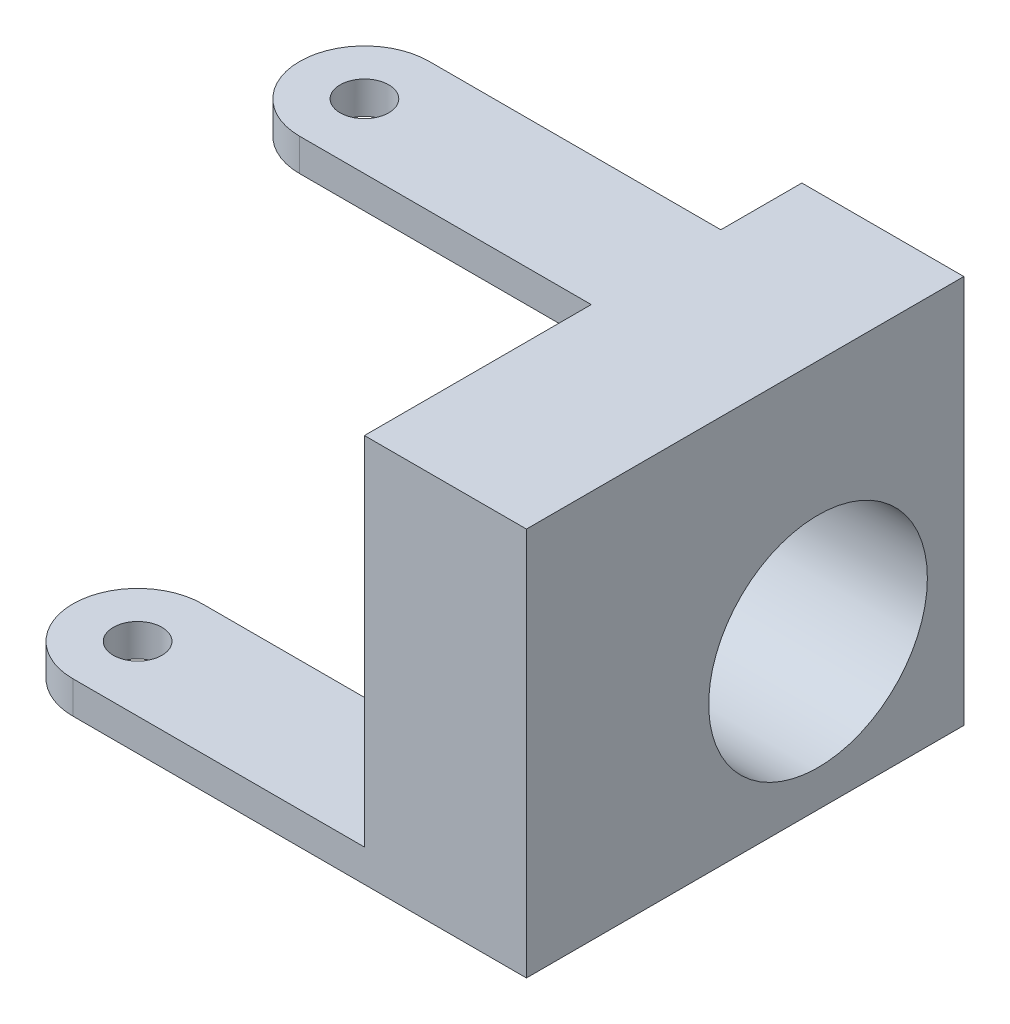
ISO-10303-21;
HEADER;
FILE_DESCRIPTION(('STEP AP214'),'2;1');
FILE_NAME('part.step','',(''),(''),'','','');
FILE_SCHEMA(('AUTOMOTIVE_DESIGN { 1 0 10303 214 1 1 1 1 }'));
ENDSEC;
DATA;
#1=APPLICATION_CONTEXT('core data for automotive mechanical design processes');
#2=APPLICATION_PROTOCOL_DEFINITION('international standard','automotive_design',2000,#1);
#3=PRODUCT_CONTEXT('',#1,'mechanical');
#4=PRODUCT('Part','Part','',(#3));
#5=PRODUCT_RELATED_PRODUCT_CATEGORY('part','',(#4));
#6=PRODUCT_DEFINITION_FORMATION('','',#4);
#7=PRODUCT_DEFINITION_CONTEXT('part definition',#1,'design');
#8=PRODUCT_DEFINITION('design','',#6,#7);
#9=PRODUCT_DEFINITION_SHAPE('','',#8);
#10=(LENGTH_UNIT() NAMED_UNIT(*) SI_UNIT(.MILLI.,.METRE.));
#11=(NAMED_UNIT(*) PLANE_ANGLE_UNIT() SI_UNIT($,.RADIAN.));
#12=(NAMED_UNIT(*) SI_UNIT($,.STERADIAN.) SOLID_ANGLE_UNIT());
#13=UNCERTAINTY_MEASURE_WITH_UNIT(LENGTH_MEASURE(1.E-05),#10,'distance_accuracy_value','');
#14=(GEOMETRIC_REPRESENTATION_CONTEXT(3) GLOBAL_UNCERTAINTY_ASSIGNED_CONTEXT((#13)) GLOBAL_UNIT_ASSIGNED_CONTEXT((#10,
#11,#12)) REPRESENTATION_CONTEXT('',''));
#15=CARTESIAN_POINT('',(0.,0.,0.));
#16=DIRECTION('',(0.,0.,1.));
#17=DIRECTION('',(1.,0.,0.));
#18=AXIS2_PLACEMENT_3D('',#15,#16,#17);
#19=CARTESIAN_POINT('',(-23.,2.,14.));
#20=DIRECTION('',(0.,1.,0.));
#21=DIRECTION('',(0.,0.,1.));
#22=AXIS2_PLACEMENT_3D('',#19,#20,#21);
#23=CYLINDRICAL_SURFACE('',#22,4.);
#24=DIRECTION('',(0.,-1.,0.));
#25=VECTOR('',#24,1.);
#26=CARTESIAN_POINT('',(-23.,2.,18.));
#27=LINE('',#26,#25);
#28=CARTESIAN_POINT('',(-23.,2.,18.));
#29=VERTEX_POINT('',#28);
#30=CARTESIAN_POINT('',(-23.,0.,18.));
#31=VERTEX_POINT('',#30);
#32=EDGE_CURVE('E214',#29,#31,#27,.T.);
#33=ORIENTED_EDGE('',*,*,#32,.F.);
#34=CARTESIAN_POINT('',(-23.,2.,14.));
#35=DIRECTION('',(0.,-1.,0.));
#36=DIRECTION('',(0.,0.,-1.));
#37=AXIS2_PLACEMENT_3D('',#34,#35,#36);
#38=CIRCLE('',#37,4.);
#39=CARTESIAN_POINT('',(-23.,2.,10.));
#40=VERTEX_POINT('',#39);
#41=EDGE_CURVE('E56',#40,#29,#38,.F.);
#42=ORIENTED_EDGE('',*,*,#41,.F.);
#43=DIRECTION('',(0.,-1.,0.));
#44=VECTOR('',#43,1.);
#45=CARTESIAN_POINT('',(-23.,2.,10.));
#46=LINE('',#45,#44);
#47=CARTESIAN_POINT('',(-23.,0.,10.));
#48=VERTEX_POINT('',#47);
#49=EDGE_CURVE('E218',#48,#40,#46,.F.);
#50=ORIENTED_EDGE('',*,*,#49,.F.);
#51=CARTESIAN_POINT('',(-23.,0.,14.));
#52=DIRECTION('',(0.,-1.,0.));
#53=DIRECTION('',(0.,0.,-1.));
#54=AXIS2_PLACEMENT_3D('',#51,#52,#53);
#55=CIRCLE('',#54,4.);
#56=EDGE_CURVE('E11',#31,#48,#55,.T.);
#57=ORIENTED_EDGE('',*,*,#56,.F.);
#58=EDGE_LOOP('',(#33,#42,#50,#57));
#59=FACE_BOUND('',#58,.T.);
#60=ADVANCED_FACE('F47',(#59),#23,.T.);
#61=CARTESIAN_POINT('',(-4.99999999999999,24.,18.));
#62=DIRECTION('',(1.,0.,0.));
#63=DIRECTION('',(0.,0.,-1.));
#64=AXIS2_PLACEMENT_3D('',#61,#62,#63);
#65=PLANE('',#64);
#66=CARTESIAN_POINT('',(-5.,9.,0.));
#67=DIRECTION('',(1.,0.,0.));
#68=DIRECTION('',(0.,0.,-1.));
#69=AXIS2_PLACEMENT_3D('',#66,#67,#68);
#70=CIRCLE('',#69,6.75);
#71=CARTESIAN_POINT('',(-5.,9.,-6.75));
#72=VERTEX_POINT('',#71);
#73=EDGE_CURVE('E175',#72,#72,#70,.F.);
#74=ORIENTED_EDGE('',*,*,#73,.F.);
#75=EDGE_LOOP('',(#74));
#76=FACE_BOUND('',#75,.T.);
#77=DIRECTION('',(0.,0.,-1.));
#78=VECTOR('',#77,1.);
#79=CARTESIAN_POINT('',(-4.99999999999999,2.,18.));
#80=LINE('',#79,#78);
#81=CARTESIAN_POINT('',(-4.99999999999999,2.,18.));
#82=VERTEX_POINT('',#81);
#83=CARTESIAN_POINT('',(-5.,2.,9.99999999999999));
#84=VERTEX_POINT('',#83);
#85=EDGE_CURVE('E282',#82,#84,#80,.T.);
#86=ORIENTED_EDGE('',*,*,#85,.F.);
#87=DIRECTION('',(0.,-1.,0.));
#88=VECTOR('',#87,1.);
#89=CARTESIAN_POINT('',(-4.99999999999999,24.,18.));
#90=LINE('',#89,#88);
#91=CARTESIAN_POINT('',(-4.99999999999999,24.,18.));
#92=VERTEX_POINT('',#91);
#93=EDGE_CURVE('E189',#92,#82,#90,.T.);
#94=ORIENTED_EDGE('',*,*,#93,.F.);
#95=DIRECTION('',(0.,0.,1.));
#96=VECTOR('',#95,1.);
#97=CARTESIAN_POINT('',(-4.99999999999999,24.,18.));
#98=LINE('',#97,#96);
#99=CARTESIAN_POINT('',(-5.,24.,4.));
#100=VERTEX_POINT('',#99);
#101=EDGE_CURVE('E161',#100,#92,#98,.T.);
#102=ORIENTED_EDGE('',*,*,#101,.F.);
#103=DIRECTION('',(0.,-1.,0.));
#104=VECTOR('',#103,1.);
#105=CARTESIAN_POINT('',(-5.,24.,4.));
#106=LINE('',#105,#104);
#107=CARTESIAN_POINT('',(-5.,22.,4.));
#108=VERTEX_POINT('',#107);
#109=EDGE_CURVE('E153',#100,#108,#106,.T.);
#110=ORIENTED_EDGE('',*,*,#109,.T.);
#111=DIRECTION('',(0.,0.,-1.));
#112=VECTOR('',#111,1.);
#113=CARTESIAN_POINT('',(-4.99999999999999,22.,18.));
#114=LINE('',#113,#112);
#115=CARTESIAN_POINT('',(-5.,22.,-4.));
#116=VERTEX_POINT('',#115);
#117=EDGE_CURVE('E151',#108,#116,#114,.T.);
#118=ORIENTED_EDGE('',*,*,#117,.T.);
#119=DIRECTION('',(0.,1.,0.));
#120=VECTOR('',#119,1.);
#121=CARTESIAN_POINT('',(-5.,24.,-4.));
#122=LINE('',#121,#120);
#123=CARTESIAN_POINT('',(-5.,24.,-4.));
#124=VERTEX_POINT('',#123);
#125=EDGE_CURVE('E133',#116,#124,#122,.T.);
#126=ORIENTED_EDGE('',*,*,#125,.T.);
#127=CARTESIAN_POINT('',(-5.,24.,-9.));
#128=VERTEX_POINT('',#127);
#129=EDGE_CURVE('E148',#128,#124,#98,.T.);
#130=ORIENTED_EDGE('',*,*,#129,.F.);
#131=DIRECTION('',(0.,-1.,0.));
#132=VECTOR('',#131,1.);
#133=CARTESIAN_POINT('',(-5.,24.,-9.));
#134=LINE('',#133,#132);
#135=CARTESIAN_POINT('',(-5.,0.,-9.));
#136=VERTEX_POINT('',#135);
#137=EDGE_CURVE('E193',#128,#136,#134,.T.);
#138=ORIENTED_EDGE('',*,*,#137,.T.);
#139=DIRECTION('',(0.,0.,1.));
#140=VECTOR('',#139,1.);
#141=CARTESIAN_POINT('',(-4.99999999999999,0.,18.));
#142=LINE('',#141,#140);
#143=CARTESIAN_POINT('',(-5.,0.,9.99999999999999));
#144=VERTEX_POINT('',#143);
#145=EDGE_CURVE('E178',#136,#144,#142,.T.);
#146=ORIENTED_EDGE('',*,*,#145,.T.);
#147=DIRECTION('',(0.,-1.,0.));
#148=VECTOR('',#147,1.);
#149=CARTESIAN_POINT('',(-5.,0.,9.99999999999999));
#150=LINE('',#149,#148);
#151=EDGE_CURVE('E277',#84,#144,#150,.T.);
#152=ORIENTED_EDGE('',*,*,#151,.F.);
#153=EDGE_LOOP('',(#86,#94,#102,#110,#118,#126,#130,#138,#146,#152));
#154=FACE_BOUND('',#153,.T.);
#155=ADVANCED_FACE('F146',(#76,#154),#65,.F.);
#156=CARTESIAN_POINT('',(-23.,24.,0.));
#157=DIRECTION('',(0.,-1.,0.));
#158=DIRECTION('',(0.,0.,-1.));
#159=AXIS2_PLACEMENT_3D('',#156,#157,#158);
#160=CYLINDRICAL_SURFACE('',#159,4.);
#161=DIRECTION('',(0.,1.,0.));
#162=VECTOR('',#161,1.);
#163=CARTESIAN_POINT('',(-23.,24.,4.00000000000001));
#164=LINE('',#163,#162);
#165=CARTESIAN_POINT('',(-23.,24.,4.00000000000001));
#166=VERTEX_POINT('',#165);
#167=CARTESIAN_POINT('',(-23.,22.,4.));
#168=VERTEX_POINT('',#167);
#169=EDGE_CURVE('E202',#166,#168,#164,.F.);
#170=ORIENTED_EDGE('',*,*,#169,.F.);
#171=CARTESIAN_POINT('',(-23.,24.,0.));
#172=DIRECTION('',(0.,-1.,0.));
#173=DIRECTION('',(0.,0.,-1.));
#174=AXIS2_PLACEMENT_3D('',#171,#172,#173);
#175=CIRCLE('',#174,4.);
#176=CARTESIAN_POINT('',(-23.,24.,-4.));
#177=VERTEX_POINT('',#176);
#178=EDGE_CURVE('E208',#177,#166,#175,.F.);
#179=ORIENTED_EDGE('',*,*,#178,.F.);
#180=DIRECTION('',(0.,1.,0.));
#181=VECTOR('',#180,1.);
#182=CARTESIAN_POINT('',(-23.,24.,-4.));
#183=LINE('',#182,#181);
#184=CARTESIAN_POINT('',(-23.,22.,-4.));
#185=VERTEX_POINT('',#184);
#186=EDGE_CURVE('E136',#185,#177,#183,.T.);
#187=ORIENTED_EDGE('',*,*,#186,.F.);
#188=CARTESIAN_POINT('',(-23.,22.,0.));
#189=DIRECTION('',(0.,-1.,0.));
#190=DIRECTION('',(0.,0.,-1.));
#191=AXIS2_PLACEMENT_3D('',#188,#189,#190);
#192=CIRCLE('',#191,4.);
#193=EDGE_CURVE('E211',#168,#185,#192,.T.);
#194=ORIENTED_EDGE('',*,*,#193,.F.);
#195=EDGE_LOOP('',(#170,#179,#187,#194));
#196=FACE_BOUND('',#195,.T.);
#197=ADVANCED_FACE('F317',(#196),#160,.T.);
#198=CARTESIAN_POINT('',(5.,24.,18.));
#199=DIRECTION('',(-1.,0.,0.));
#200=DIRECTION('',(0.,0.,1.));
#201=AXIS2_PLACEMENT_3D('',#198,#199,#200);
#202=PLANE('',#201);
#203=DIRECTION('',(0.,-1.,0.));
#204=VECTOR('',#203,1.);
#205=CARTESIAN_POINT('',(5.,24.,-9.));
#206=LINE('',#205,#204);
#207=CARTESIAN_POINT('',(5.,24.,-9.));
#208=VERTEX_POINT('',#207);
#209=CARTESIAN_POINT('',(5.,0.,-9.));
#210=VERTEX_POINT('',#209);
#211=EDGE_CURVE('E196',#208,#210,#206,.T.);
#212=ORIENTED_EDGE('',*,*,#211,.F.);
#213=DIRECTION('',(0.,0.,-1.));
#214=VECTOR('',#213,1.);
#215=CARTESIAN_POINT('',(5.,24.,18.));
#216=LINE('',#215,#214);
#217=CARTESIAN_POINT('',(5.,24.,18.));
#218=VERTEX_POINT('',#217);
#219=EDGE_CURVE('E185',#218,#208,#216,.T.);
#220=ORIENTED_EDGE('',*,*,#219,.F.);
#221=DIRECTION('',(0.,-1.,0.));
#222=VECTOR('',#221,1.);
#223=CARTESIAN_POINT('',(5.,24.,18.));
#224=LINE('',#223,#222);
#225=CARTESIAN_POINT('',(5.,0.,18.));
#226=VERTEX_POINT('',#225);
#227=EDGE_CURVE('E165',#218,#226,#224,.T.);
#228=ORIENTED_EDGE('',*,*,#227,.T.);
#229=DIRECTION('',(0.,0.,-1.));
#230=VECTOR('',#229,1.);
#231=CARTESIAN_POINT('',(5.,0.,18.));
#232=LINE('',#231,#230);
#233=EDGE_CURVE('E170',#226,#210,#232,.T.);
#234=ORIENTED_EDGE('',*,*,#233,.T.);
#235=EDGE_LOOP('',(#212,#220,#228,#234));
#236=FACE_BOUND('',#235,.T.);
#237=CARTESIAN_POINT('',(5.,9.,0.));
#238=DIRECTION('',(1.,0.,0.));
#239=DIRECTION('',(0.,0.,-1.));
#240=AXIS2_PLACEMENT_3D('',#237,#238,#239);
#241=CIRCLE('',#240,6.75);
#242=CARTESIAN_POINT('',(5.,9.,-6.75));
#243=VERTEX_POINT('',#242);
#244=EDGE_CURVE('E256',#243,#243,#241,.T.);
#245=ORIENTED_EDGE('',*,*,#244,.F.);
#246=EDGE_LOOP('',(#245));
#247=FACE_BOUND('',#246,.T.);
#248=ADVANCED_FACE('F270',(#236,#247),#202,.F.);
#249=CARTESIAN_POINT('',(-5.,24.,-9.));
#250=DIRECTION('',(0.,0.,1.));
#251=DIRECTION('',(1.,0.,0.));
#252=AXIS2_PLACEMENT_3D('',#249,#250,#251);
#253=PLANE('',#252);
#254=DIRECTION('',(-1.,0.,0.));
#255=VECTOR('',#254,1.);
#256=CARTESIAN_POINT('',(-5.,0.,-9.));
#257=LINE('',#256,#255);
#258=EDGE_CURVE('E174',#210,#136,#257,.T.);
#259=ORIENTED_EDGE('',*,*,#258,.T.);
#260=ORIENTED_EDGE('',*,*,#137,.F.);
#261=DIRECTION('',(-1.,0.,0.));
#262=VECTOR('',#261,1.);
#263=CARTESIAN_POINT('',(-5.,24.,-9.));
#264=LINE('',#263,#262);
#265=EDGE_CURVE('E157',#208,#128,#264,.T.);
#266=ORIENTED_EDGE('',*,*,#265,.F.);
#267=ORIENTED_EDGE('',*,*,#211,.T.);
#268=EDGE_LOOP('',(#259,#260,#266,#267));
#269=FACE_BOUND('',#268,.T.);
#270=ADVANCED_FACE('F269',(#269),#253,.F.);
#271=CARTESIAN_POINT('',(-4.99999999999999,24.,18.));
#272=DIRECTION('',(0.,0.,-1.));
#273=DIRECTION('',(-1.,0.,0.));
#274=AXIS2_PLACEMENT_3D('',#271,#272,#273);
#275=PLANE('',#274);
#276=DIRECTION('',(1.,0.,0.));
#277=VECTOR('',#276,1.);
#278=CARTESIAN_POINT('',(-27.,2.,18.));
#279=LINE('',#278,#277);
#280=EDGE_CURVE('E226',#29,#82,#279,.T.);
#281=ORIENTED_EDGE('',*,*,#280,.F.);
#282=ORIENTED_EDGE('',*,*,#32,.T.);
#283=DIRECTION('',(1.,0.,0.));
#284=VECTOR('',#283,1.);
#285=CARTESIAN_POINT('',(-4.99999999999999,0.,18.));
#286=LINE('',#285,#284);
#287=EDGE_CURVE('E182',#31,#226,#286,.T.);
#288=ORIENTED_EDGE('',*,*,#287,.T.);
#289=ORIENTED_EDGE('',*,*,#227,.F.);
#290=DIRECTION('',(1.,0.,0.));
#291=VECTOR('',#290,1.);
#292=CARTESIAN_POINT('',(-4.99999999999999,24.,18.));
#293=LINE('',#292,#291);
#294=EDGE_CURVE('E160',#92,#218,#293,.T.);
#295=ORIENTED_EDGE('',*,*,#294,.F.);
#296=ORIENTED_EDGE('',*,*,#93,.T.);
#297=EDGE_LOOP('',(#281,#282,#288,#289,#295,#296));
#298=FACE_BOUND('',#297,.T.);
#299=ADVANCED_FACE('F229',(#298),#275,.F.);
#300=CARTESIAN_POINT('',(0.,24.,0.));
#301=DIRECTION('',(0.,-1.,0.));
#302=DIRECTION('',(0.,0.,-1.));
#303=AXIS2_PLACEMENT_3D('',#300,#301,#302);
#304=PLANE('',#303);
#305=CARTESIAN_POINT('',(-23.,24.,0.));
#306=DIRECTION('',(0.,1.,0.));
#307=DIRECTION('',(0.,0.,1.));
#308=AXIS2_PLACEMENT_3D('',#305,#306,#307);
#309=CIRCLE('',#308,1.5);
#310=CARTESIAN_POINT('',(-23.,24.,1.5));
#311=VERTEX_POINT('',#310);
#312=EDGE_CURVE('E233',#311,#311,#309,.T.);
#313=ORIENTED_EDGE('',*,*,#312,.F.);
#314=EDGE_LOOP('',(#313));
#315=FACE_BOUND('',#314,.T.);
#316=DIRECTION('',(1.,0.,0.));
#317=VECTOR('',#316,1.);
#318=CARTESIAN_POINT('',(-27.,24.,-4.));
#319=LINE('',#318,#317);
#320=EDGE_CURVE('E129',#177,#124,#319,.T.);
#321=ORIENTED_EDGE('',*,*,#320,.F.);
#322=ORIENTED_EDGE('',*,*,#178,.T.);
#323=DIRECTION('',(1.,0.,0.));
#324=VECTOR('',#323,1.);
#325=CARTESIAN_POINT('',(-27.,24.,4.00000000000001));
#326=LINE('',#325,#324);
#327=EDGE_CURVE('E140',#166,#100,#326,.T.);
#328=ORIENTED_EDGE('',*,*,#327,.T.);
#329=ORIENTED_EDGE('',*,*,#101,.T.);
#330=ORIENTED_EDGE('',*,*,#294,.T.);
#331=ORIENTED_EDGE('',*,*,#219,.T.);
#332=ORIENTED_EDGE('',*,*,#265,.T.);
#333=ORIENTED_EDGE('',*,*,#129,.T.);
#334=EDGE_LOOP('',(#321,#322,#328,#329,#330,#331,#332,#333));
#335=FACE_BOUND('',#334,.T.);
#336=ADVANCED_FACE('F155',(#315,#335),#304,.F.);
#337=CARTESIAN_POINT('',(0.,0.,0.));
#338=DIRECTION('',(0.,-1.,0.));
#339=DIRECTION('',(0.,0.,-1.));
#340=AXIS2_PLACEMENT_3D('',#337,#338,#339);
#341=PLANE('',#340);
#342=CARTESIAN_POINT('',(-23.,0.,14.));
#343=DIRECTION('',(0.,-1.,0.));
#344=DIRECTION('',(0.,0.,-1.));
#345=AXIS2_PLACEMENT_3D('',#342,#343,#344);
#346=CIRCLE('',#345,1.5);
#347=CARTESIAN_POINT('',(-23.,0.,15.5));
#348=VERTEX_POINT('',#347);
#349=EDGE_CURVE('E286',#348,#348,#346,.F.);
#350=ORIENTED_EDGE('',*,*,#349,.T.);
#351=EDGE_LOOP('',(#350));
#352=FACE_BOUND('',#351,.T.);
#353=ORIENTED_EDGE('',*,*,#287,.F.);
#354=ORIENTED_EDGE('',*,*,#56,.T.);
#355=DIRECTION('',(1.,0.,0.));
#356=VECTOR('',#355,1.);
#357=CARTESIAN_POINT('',(-27.,0.,10.));
#358=LINE('',#357,#356);
#359=EDGE_CURVE('E240',#48,#144,#358,.T.);
#360=ORIENTED_EDGE('',*,*,#359,.T.);
#361=ORIENTED_EDGE('',*,*,#145,.F.);
#362=ORIENTED_EDGE('',*,*,#258,.F.);
#363=ORIENTED_EDGE('',*,*,#233,.F.);
#364=EDGE_LOOP('',(#353,#354,#360,#361,#362,#363));
#365=FACE_BOUND('',#364,.T.);
#366=ADVANCED_FACE('F273',(#352,#365),#341,.T.);
#367=CARTESIAN_POINT('',(-24.0918830920368,9.,0.));
#368=DIRECTION('',(1.,0.,0.));
#369=DIRECTION('',(0.,0.,-1.));
#370=AXIS2_PLACEMENT_3D('',#367,#368,#369);
#371=CYLINDRICAL_SURFACE('',#370,6.75);
#372=ORIENTED_EDGE('',*,*,#73,.T.);
#373=EDGE_LOOP('',(#372));
#374=FACE_BOUND('',#373,.T.);
#375=ORIENTED_EDGE('',*,*,#244,.T.);
#376=EDGE_LOOP('',(#375));
#377=FACE_BOUND('',#376,.T.);
#378=ADVANCED_FACE('F343',(#374,#377),#371,.F.);
#379=CARTESIAN_POINT('',(-27.,22.,4.00000000000001));
#380=DIRECTION('',(0.,-1.,0.));
#381=DIRECTION('',(0.,0.,-1.));
#382=AXIS2_PLACEMENT_3D('',#379,#380,#381);
#383=PLANE('',#382);
#384=CARTESIAN_POINT('',(-23.,22.,0.));
#385=DIRECTION('',(0.,-1.,0.));
#386=DIRECTION('',(0.,0.,-1.));
#387=AXIS2_PLACEMENT_3D('',#384,#385,#386);
#388=CIRCLE('',#387,1.5);
#389=CARTESIAN_POINT('',(-23.,22.,-1.5));
#390=VERTEX_POINT('',#389);
#391=EDGE_CURVE('E238',#390,#390,#388,.F.);
#392=ORIENTED_EDGE('',*,*,#391,.T.);
#393=EDGE_LOOP('',(#392));
#394=FACE_BOUND('',#393,.T.);
#395=DIRECTION('',(1.,0.,0.));
#396=VECTOR('',#395,1.);
#397=CARTESIAN_POINT('',(-27.,22.,4.00000000000001));
#398=LINE('',#397,#396);
#399=EDGE_CURVE('E247',#168,#108,#398,.T.);
#400=ORIENTED_EDGE('',*,*,#399,.F.);
#401=ORIENTED_EDGE('',*,*,#193,.T.);
#402=DIRECTION('',(1.,0.,0.));
#403=VECTOR('',#402,1.);
#404=CARTESIAN_POINT('',(-27.,22.,-3.99999999999999));
#405=LINE('',#404,#403);
#406=EDGE_CURVE('E141',#185,#116,#405,.T.);
#407=ORIENTED_EDGE('',*,*,#406,.T.);
#408=ORIENTED_EDGE('',*,*,#117,.F.);
#409=EDGE_LOOP('',(#400,#401,#407,#408));
#410=FACE_BOUND('',#409,.T.);
#411=ADVANCED_FACE('F357',(#394,#410),#383,.T.);
#412=CARTESIAN_POINT('',(-27.,24.,4.00000000000001));
#413=DIRECTION('',(0.,0.,1.));
#414=DIRECTION('',(0.,-1.,0.));
#415=AXIS2_PLACEMENT_3D('',#412,#413,#414);
#416=PLANE('',#415);
#417=ORIENTED_EDGE('',*,*,#327,.F.);
#418=ORIENTED_EDGE('',*,*,#169,.T.);
#419=ORIENTED_EDGE('',*,*,#399,.T.);
#420=ORIENTED_EDGE('',*,*,#109,.F.);
#421=EDGE_LOOP('',(#417,#418,#419,#420));
#422=FACE_BOUND('',#421,.T.);
#423=ADVANCED_FACE('F353',(#422),#416,.T.);
#424=CARTESIAN_POINT('',(-27.,24.,-4.));
#425=DIRECTION('',(0.,0.,-1.));
#426=DIRECTION('',(0.,1.,0.));
#427=AXIS2_PLACEMENT_3D('',#424,#425,#426);
#428=PLANE('',#427);
#429=ORIENTED_EDGE('',*,*,#406,.F.);
#430=ORIENTED_EDGE('',*,*,#186,.T.);
#431=ORIENTED_EDGE('',*,*,#320,.T.);
#432=ORIENTED_EDGE('',*,*,#125,.F.);
#433=EDGE_LOOP('',(#429,#430,#431,#432));
#434=FACE_BOUND('',#433,.T.);
#435=ADVANCED_FACE('F132',(#434),#428,.T.);
#436=CARTESIAN_POINT('',(-23.,17.7573593128807,0.));
#437=DIRECTION('',(0.,1.,0.));
#438=DIRECTION('',(0.,0.,1.));
#439=AXIS2_PLACEMENT_3D('',#436,#437,#438);
#440=CYLINDRICAL_SURFACE('',#439,1.5);
#441=ORIENTED_EDGE('',*,*,#312,.T.);
#442=EDGE_LOOP('',(#441));
#443=FACE_BOUND('',#442,.T.);
#444=ORIENTED_EDGE('',*,*,#391,.F.);
#445=EDGE_LOOP('',(#444));
#446=FACE_BOUND('',#445,.T.);
#447=ADVANCED_FACE('F301',(#443,#446),#440,.F.);
#448=CARTESIAN_POINT('',(-27.,2.,18.));
#449=DIRECTION('',(0.,-1.,0.));
#450=DIRECTION('',(0.,0.,-1.));
#451=AXIS2_PLACEMENT_3D('',#448,#449,#450);
#452=PLANE('',#451);
#453=CARTESIAN_POINT('',(-23.,2.,14.));
#454=DIRECTION('',(0.,1.,0.));
#455=DIRECTION('',(0.,0.,1.));
#456=AXIS2_PLACEMENT_3D('',#453,#454,#455);
#457=CIRCLE('',#456,1.5);
#458=CARTESIAN_POINT('',(-23.,2.,15.5));
#459=VERTEX_POINT('',#458);
#460=EDGE_CURVE('E292',#459,#459,#457,.T.);
#461=ORIENTED_EDGE('',*,*,#460,.F.);
#462=EDGE_LOOP('',(#461));
#463=FACE_BOUND('',#462,.T.);
#464=DIRECTION('',(1.,0.,0.));
#465=VECTOR('',#464,1.);
#466=CARTESIAN_POINT('',(-27.,2.,10.));
#467=LINE('',#466,#465);
#468=EDGE_CURVE('E227',#40,#84,#467,.T.);
#469=ORIENTED_EDGE('',*,*,#468,.F.);
#470=ORIENTED_EDGE('',*,*,#41,.T.);
#471=ORIENTED_EDGE('',*,*,#280,.T.);
#472=ORIENTED_EDGE('',*,*,#85,.T.);
#473=EDGE_LOOP('',(#469,#470,#471,#472));
#474=FACE_BOUND('',#473,.T.);
#475=ADVANCED_FACE('F223',(#463,#474),#452,.F.);
#476=CARTESIAN_POINT('',(-27.,0.,10.));
#477=DIRECTION('',(0.,0.,1.));
#478=DIRECTION('',(1.,0.,0.));
#479=AXIS2_PLACEMENT_3D('',#476,#477,#478);
#480=PLANE('',#479);
#481=ORIENTED_EDGE('',*,*,#359,.F.);
#482=ORIENTED_EDGE('',*,*,#49,.T.);
#483=ORIENTED_EDGE('',*,*,#468,.T.);
#484=ORIENTED_EDGE('',*,*,#151,.T.);
#485=EDGE_LOOP('',(#481,#482,#483,#484));
#486=FACE_BOUND('',#485,.T.);
#487=ADVANCED_FACE('F280',(#486),#480,.F.);
#488=CARTESIAN_POINT('',(-23.,-4.24264068711929,14.));
#489=DIRECTION('',(0.,1.,0.));
#490=DIRECTION('',(0.,0.,1.));
#491=AXIS2_PLACEMENT_3D('',#488,#489,#490);
#492=CYLINDRICAL_SURFACE('',#491,1.5);
#493=CARTESIAN_POINT('',(-23.,2.,15.5));
#494=CARTESIAN_POINT('',(-23.,1.97916666666667,15.5));
#495=CARTESIAN_POINT('',(-23.,1.95833333333333,15.5));
#496=CARTESIAN_POINT('',(-23.,1.91666666666667,15.5));
#497=CARTESIAN_POINT('',(-23.,1.89583333333333,15.5));
#498=CARTESIAN_POINT('',(-23.,1.85416666666667,15.5));
#499=CARTESIAN_POINT('',(-23.,1.83333333333333,15.5));
#500=CARTESIAN_POINT('',(-23.,1.79166666666667,15.5));
#501=CARTESIAN_POINT('',(-23.,1.77083333333333,15.5));
#502=CARTESIAN_POINT('',(-23.,1.72916666666667,15.5));
#503=CARTESIAN_POINT('',(-23.,1.70833333333333,15.5));
#504=CARTESIAN_POINT('',(-23.,1.66666666666667,15.5));
#505=CARTESIAN_POINT('',(-23.,1.64583333333333,15.5));
#506=CARTESIAN_POINT('',(-23.,1.60416666666667,15.5));
#507=CARTESIAN_POINT('',(-23.,1.58333333333333,15.5));
#508=CARTESIAN_POINT('',(-23.,1.54166666666667,15.5));
#509=CARTESIAN_POINT('',(-23.,1.52083333333333,15.5));
#510=CARTESIAN_POINT('',(-23.,1.47916666666667,15.5));
#511=CARTESIAN_POINT('',(-23.,1.45833333333333,15.5));
#512=CARTESIAN_POINT('',(-23.,1.41666666666667,15.5));
#513=CARTESIAN_POINT('',(-23.,1.39583333333333,15.5));
#514=CARTESIAN_POINT('',(-23.,1.35416666666667,15.5));
#515=CARTESIAN_POINT('',(-23.,1.33333333333333,15.5));
#516=CARTESIAN_POINT('',(-23.,1.29166666666667,15.5));
#517=CARTESIAN_POINT('',(-23.,1.27083333333333,15.5));
#518=CARTESIAN_POINT('',(-23.,1.22916666666667,15.5));
#519=CARTESIAN_POINT('',(-23.,1.20833333333333,15.5));
#520=CARTESIAN_POINT('',(-23.,1.16666666666667,15.5));
#521=CARTESIAN_POINT('',(-23.,1.14583333333333,15.5));
#522=CARTESIAN_POINT('',(-23.,1.10416666666667,15.5));
#523=CARTESIAN_POINT('',(-23.,1.08333333333333,15.5));
#524=CARTESIAN_POINT('',(-23.,1.04166666666667,15.5));
#525=CARTESIAN_POINT('',(-23.,1.02083333333333,15.5));
#526=CARTESIAN_POINT('',(-23.,0.979166666666667,15.5));
#527=CARTESIAN_POINT('',(-23.,0.958333333333333,15.5));
#528=CARTESIAN_POINT('',(-23.,0.916666666666667,15.5));
#529=CARTESIAN_POINT('',(-23.,0.895833333333333,15.5));
#530=CARTESIAN_POINT('',(-23.,0.854166666666667,15.5));
#531=CARTESIAN_POINT('',(-23.,0.833333333333333,15.5));
#532=CARTESIAN_POINT('',(-23.,0.791666666666667,15.5));
#533=CARTESIAN_POINT('',(-23.,0.770833333333333,15.5));
#534=CARTESIAN_POINT('',(-23.,0.729166666666667,15.5));
#535=CARTESIAN_POINT('',(-23.,0.708333333333333,15.5));
#536=CARTESIAN_POINT('',(-23.,0.666666666666667,15.5));
#537=CARTESIAN_POINT('',(-23.,0.645833333333334,15.5));
#538=CARTESIAN_POINT('',(-23.,0.604166666666667,15.5));
#539=CARTESIAN_POINT('',(-23.,0.583333333333334,15.5));
#540=CARTESIAN_POINT('',(-23.,0.541666666666667,15.5));
#541=CARTESIAN_POINT('',(-23.,0.520833333333334,15.5));
#542=CARTESIAN_POINT('',(-23.,0.479166666666667,15.5));
#543=CARTESIAN_POINT('',(-23.,0.458333333333334,15.5));
#544=CARTESIAN_POINT('',(-23.,0.416666666666667,15.5));
#545=CARTESIAN_POINT('',(-23.,0.395833333333334,15.5));
#546=CARTESIAN_POINT('',(-23.,0.354166666666667,15.5));
#547=CARTESIAN_POINT('',(-23.,0.333333333333334,15.5));
#548=CARTESIAN_POINT('',(-23.,0.291666666666668,15.5));
#549=CARTESIAN_POINT('',(-23.,0.270833333333334,15.5));
#550=CARTESIAN_POINT('',(-23.,0.229166666666668,15.5));
#551=CARTESIAN_POINT('',(-23.,0.208333333333334,15.5));
#552=CARTESIAN_POINT('',(-23.,0.166666666666668,15.5));
#553=CARTESIAN_POINT('',(-23.,0.145833333333334,15.5));
#554=CARTESIAN_POINT('',(-23.,0.104166666666668,15.5));
#555=CARTESIAN_POINT('',(-23.,0.0833333333333343,15.5));
#556=CARTESIAN_POINT('',(-23.,0.0416666666666676,15.5));
#557=CARTESIAN_POINT('',(-23.,0.0208333333333342,15.5));
#558=CARTESIAN_POINT('',(-23.,0.,15.5));
#559=B_SPLINE_CURVE_WITH_KNOTS('',3,(#493,#494,#495,#496,#497,#498,#499,#500,#501,#502,#503,
#504,#505,#506,#507,#508,#509,#510,#511,#512,#513,#514,#515,#516,#517,#518,#519,#520,#521,#522,
#523,#524,#525,#526,#527,#528,#529,#530,#531,#532,#533,#534,#535,#536,#537,#538,#539,#540,#541,
#542,#543,#544,#545,#546,#547,#548,#549,#550,#551,#552,#553,#554,#555,#556,#557,#558),
.UNSPECIFIED.,.F.,.F.,(4,2,2,2,2,2,2,2,2,2,2,2,2,2,2,2,2,2,2,2,2,2,2,2,2,2,2,2,2,2,2,2,4),(0.,
0.0625000000000001,0.125,0.1875,0.25,0.312499999999999,0.374999999999999,0.4375,0.5,0.5625,
0.625,0.6875,0.749999999999999,0.812499999999999,0.874999999999999,0.937499999999999,
0.999999999999999,1.0625,1.125,1.1875,1.25,1.3125,1.375,1.4375,1.5,1.5625,1.625,1.6875,1.75,
1.8125,1.875,1.9375,2.),.UNSPECIFIED.);
#560=EDGE_CURVE('BSEAM297',#459,#348,#559,.T.);
#561=ORIENTED_EDGE('',*,*,#460,.T.);
#562=ORIENTED_EDGE('',*,*,#349,.F.);
#563=ORIENTED_EDGE('',*,*,#560,.T.);
#564=ORIENTED_EDGE('',*,*,#560,.F.);
#565=EDGE_LOOP('',(#561,#563,#562,#564));
#566=FACE_BOUND('',#565,.T.);
#567=ADVANCED_FACE('F297',(#566),#492,.F.);
#568=CLOSED_SHELL('',(#60,#155,#197,#248,#270,#299,#336,#366,#378,#411,#423,#435,#447,#475,#487,#567));
#569=MANIFOLD_SOLID_BREP('B2',#568);
#570=ADVANCED_BREP_SHAPE_REPRESENTATION('',(#18,#569),#14);
#571=SHAPE_DEFINITION_REPRESENTATION(#9,#570);
ENDSEC;
END-ISO-10303-21;
